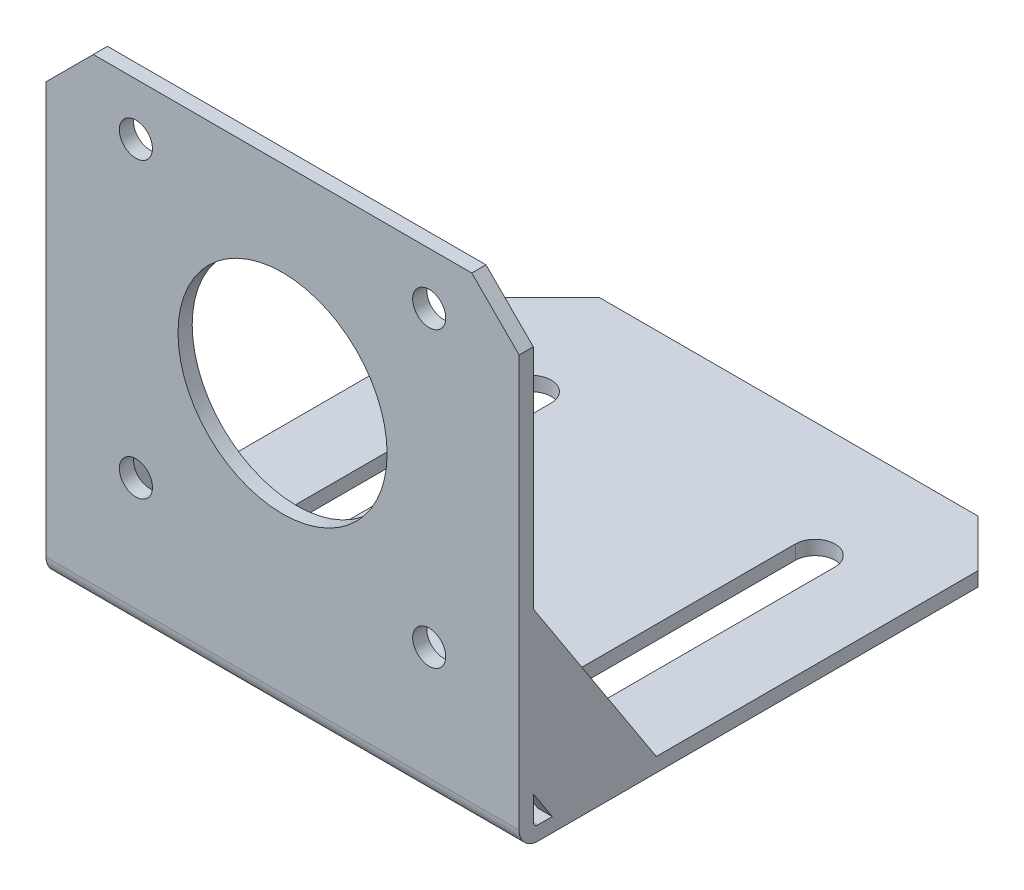
ISO-10303-21;
HEADER;
FILE_DESCRIPTION(('STEP AP214'),'2;1');
FILE_NAME('part.step','',(''),(''),'','','');
FILE_SCHEMA(('AUTOMOTIVE_DESIGN { 1 0 10303 214 1 1 1 1 }'));
ENDSEC;
DATA;
#1=APPLICATION_CONTEXT('core data for automotive mechanical design processes');
#2=APPLICATION_PROTOCOL_DEFINITION('international standard','automotive_design',2000,#1);
#3=PRODUCT_CONTEXT('',#1,'mechanical');
#4=PRODUCT('Part','Part','',(#3));
#5=PRODUCT_RELATED_PRODUCT_CATEGORY('part','',(#4));
#6=PRODUCT_DEFINITION_FORMATION('','',#4);
#7=PRODUCT_DEFINITION_CONTEXT('part definition',#1,'design');
#8=PRODUCT_DEFINITION('design','',#6,#7);
#9=PRODUCT_DEFINITION_SHAPE('','',#8);
#10=(LENGTH_UNIT() NAMED_UNIT(*) SI_UNIT(.MILLI.,.METRE.));
#11=(NAMED_UNIT(*) PLANE_ANGLE_UNIT() SI_UNIT($,.RADIAN.));
#12=(NAMED_UNIT(*) SI_UNIT($,.STERADIAN.) SOLID_ANGLE_UNIT());
#13=UNCERTAINTY_MEASURE_WITH_UNIT(LENGTH_MEASURE(1.E-05),#10,'distance_accuracy_value','');
#14=(GEOMETRIC_REPRESENTATION_CONTEXT(3) GLOBAL_UNCERTAINTY_ASSIGNED_CONTEXT((#13)) GLOBAL_UNIT_ASSIGNED_CONTEXT((#10,
#11,#12)) REPRESENTATION_CONTEXT('',''));
#15=CARTESIAN_POINT('',(0.,0.,0.));
#16=DIRECTION('',(0.,0.,1.));
#17=DIRECTION('',(1.,0.,0.));
#18=AXIS2_PLACEMENT_3D('',#15,#16,#17);
#19=CARTESIAN_POINT('',(50.,1.5,-2.00000000000001));
#20=DIRECTION('',(0.,1.,0.));
#21=DIRECTION('',(0.,0.,1.));
#22=AXIS2_PLACEMENT_3D('',#19,#20,#21);
#23=PLANE('',#22);
#24=CARTESIAN_POINT('',(40.,1.5,-13.7066664875901));
#25=DIRECTION('',(0.,1.,0.));
#26=DIRECTION('',(0.,0.,-1.));
#27=AXIS2_PLACEMENT_3D('',#24,#25,#26);
#28=CIRCLE('',#27,2.1);
#29=CARTESIAN_POINT('',(37.9,1.5,-13.7066664875901));
#30=VERTEX_POINT('',#29);
#31=CARTESIAN_POINT('',(42.1,1.5,-13.7066664875901));
#32=VERTEX_POINT('',#31);
#33=EDGE_CURVE('E229',#30,#32,#28,.T.);
#34=ORIENTED_EDGE('',*,*,#33,.F.);
#35=DIRECTION('',(0.,0.,1.));
#36=VECTOR('',#35,1.);
#37=CARTESIAN_POINT('',(37.9,1.5,-13.7066664875901));
#38=LINE('',#37,#36);
#39=CARTESIAN_POINT('',(37.9,1.5,-41.2933335124099));
#40=VERTEX_POINT('',#39);
#41=EDGE_CURVE('E247',#40,#30,#38,.T.);
#42=ORIENTED_EDGE('',*,*,#41,.F.);
#43=CARTESIAN_POINT('',(40.,1.5,-41.2933335124099));
#44=DIRECTION('',(0.,1.,0.));
#45=DIRECTION('',(0.,0.,-1.));
#46=AXIS2_PLACEMENT_3D('',#43,#44,#45);
#47=CIRCLE('',#46,2.09999999999998);
#48=CARTESIAN_POINT('',(42.1,1.5,-41.2933335124099));
#49=VERTEX_POINT('',#48);
#50=EDGE_CURVE('E250',#49,#40,#47,.T.);
#51=ORIENTED_EDGE('',*,*,#50,.F.);
#52=DIRECTION('',(0.,0.,-1.));
#53=VECTOR('',#52,1.);
#54=CARTESIAN_POINT('',(42.1,1.5,-13.7066664875901));
#55=LINE('',#54,#53);
#56=EDGE_CURVE('E256',#32,#49,#55,.T.);
#57=ORIENTED_EDGE('',*,*,#56,.F.);
#58=EDGE_LOOP('',(#34,#42,#51,#57));
#59=FACE_BOUND('',#58,.T.);
#60=CARTESIAN_POINT('',(10.,1.5,-13.7066664875901));
#61=DIRECTION('',(0.,1.,0.));
#62=DIRECTION('',(0.,0.,1.));
#63=AXIS2_PLACEMENT_3D('',#60,#61,#62);
#64=CIRCLE('',#63,2.10000000000001);
#65=CARTESIAN_POINT('',(7.9,1.5,-13.7066664875901));
#66=VERTEX_POINT('',#65);
#67=CARTESIAN_POINT('',(12.1,1.5,-13.7066664875901));
#68=VERTEX_POINT('',#67);
#69=EDGE_CURVE('E262',#66,#68,#64,.T.);
#70=ORIENTED_EDGE('',*,*,#69,.F.);
#71=DIRECTION('',(0.,0.,1.));
#72=VECTOR('',#71,1.);
#73=CARTESIAN_POINT('',(7.9,1.5,-13.7066664875901));
#74=LINE('',#73,#72);
#75=CARTESIAN_POINT('',(7.90000000000001,1.5,-41.2933335124099));
#76=VERTEX_POINT('',#75);
#77=EDGE_CURVE('E270',#76,#66,#74,.T.);
#78=ORIENTED_EDGE('',*,*,#77,.F.);
#79=CARTESIAN_POINT('',(10.,1.5,-41.2933335124099));
#80=DIRECTION('',(0.,1.,0.));
#81=DIRECTION('',(0.,0.,1.));
#82=AXIS2_PLACEMENT_3D('',#79,#80,#81);
#83=CIRCLE('',#82,2.09999999999999);
#84=CARTESIAN_POINT('',(12.1,1.5,-41.2933335124099));
#85=VERTEX_POINT('',#84);
#86=EDGE_CURVE('E284',#85,#76,#83,.T.);
#87=ORIENTED_EDGE('',*,*,#86,.F.);
#88=DIRECTION('',(0.,0.,-1.));
#89=VECTOR('',#88,1.);
#90=CARTESIAN_POINT('',(12.1,1.5,-13.7066664875901));
#91=LINE('',#90,#89);
#92=EDGE_CURVE('E281',#68,#85,#91,.T.);
#93=ORIENTED_EDGE('',*,*,#92,.F.);
#94=EDGE_LOOP('',(#70,#78,#87,#93));
#95=FACE_BOUND('',#94,.T.);
#96=DIRECTION('',(-1.,0.,0.));
#97=VECTOR('',#96,1.);
#98=CARTESIAN_POINT('',(50.,1.5,-53.5));
#99=LINE('',#98,#97);
#100=CARTESIAN_POINT('',(45.,1.5,-53.5));
#101=VERTEX_POINT('',#100);
#102=CARTESIAN_POINT('',(5.00000000000003,1.5,-53.5));
#103=VERTEX_POINT('',#102);
#104=EDGE_CURVE('E430',#101,#103,#99,.T.);
#105=ORIENTED_EDGE('',*,*,#104,.T.);
#106=DIRECTION('',(-0.707106781186549,0.,0.707106781186547));
#107=VECTOR('',#106,1.);
#108=CARTESIAN_POINT('',(1.75000000000008,1.5,-50.2500000000001));
#109=LINE('',#108,#107);
#110=CARTESIAN_POINT('',(0.,1.5,-48.5));
#111=VERTEX_POINT('',#110);
#112=EDGE_CURVE('E11',#103,#111,#109,.T.);
#113=ORIENTED_EDGE('',*,*,#112,.T.);
#114=DIRECTION('',(0.,0.,-1.));
#115=VECTOR('',#114,1.);
#116=CARTESIAN_POINT('',(0.,1.5,-2.00000000000001));
#117=LINE('',#116,#115);
#118=CARTESIAN_POINT('',(0.,1.5,-14.5));
#119=VERTEX_POINT('',#118);
#120=EDGE_CURVE('E401',#119,#111,#117,.T.);
#121=ORIENTED_EDGE('',*,*,#120,.F.);
#122=DIRECTION('',(-1.,0.,0.));
#123=VECTOR('',#122,1.);
#124=CARTESIAN_POINT('',(1.5,1.5,-14.5));
#125=LINE('',#124,#123);
#126=CARTESIAN_POINT('',(1.5,1.5,-14.5));
#127=VERTEX_POINT('',#126);
#128=EDGE_CURVE('E318',#127,#119,#125,.T.);
#129=ORIENTED_EDGE('',*,*,#128,.F.);
#130=DIRECTION('',(0.,0.,-1.));
#131=VECTOR('',#130,1.);
#132=CARTESIAN_POINT('',(1.5,1.5,-3.5));
#133=LINE('',#132,#131);
#134=CARTESIAN_POINT('',(1.5,1.5,-3.5));
#135=VERTEX_POINT('',#134);
#136=EDGE_CURVE('E304',#135,#127,#133,.T.);
#137=ORIENTED_EDGE('',*,*,#136,.F.);
#138=DIRECTION('',(-1.,0.,0.));
#139=VECTOR('',#138,1.);
#140=CARTESIAN_POINT('',(1.5,1.5,-3.5));
#141=LINE('',#140,#139);
#142=CARTESIAN_POINT('',(0.,1.5,-3.5));
#143=VERTEX_POINT('',#142);
#144=EDGE_CURVE('E315',#135,#143,#141,.T.);
#145=ORIENTED_EDGE('',*,*,#144,.T.);
#146=CARTESIAN_POINT('',(0.,1.5,-2.00000000000001));
#147=VERTEX_POINT('',#146);
#148=EDGE_CURVE('E402',#147,#143,#117,.T.);
#149=ORIENTED_EDGE('',*,*,#148,.F.);
#150=DIRECTION('',(-1.,0.,0.));
#151=VECTOR('',#150,1.);
#152=CARTESIAN_POINT('',(50.,1.5,-2.00000000000001));
#153=LINE('',#152,#151);
#154=CARTESIAN_POINT('',(50.,1.5,-2.00000000000001));
#155=VERTEX_POINT('',#154);
#156=EDGE_CURVE('E428',#155,#147,#153,.T.);
#157=ORIENTED_EDGE('',*,*,#156,.F.);
#158=DIRECTION('',(0.,0.,-1.));
#159=VECTOR('',#158,1.);
#160=CARTESIAN_POINT('',(50.,1.5,-2.00000000000001));
#161=LINE('',#160,#159);
#162=CARTESIAN_POINT('',(50.,1.5,-3.5));
#163=VERTEX_POINT('',#162);
#164=EDGE_CURVE('E386',#155,#163,#161,.T.);
#165=ORIENTED_EDGE('',*,*,#164,.T.);
#166=DIRECTION('',(1.,0.,0.));
#167=VECTOR('',#166,1.);
#168=CARTESIAN_POINT('',(48.5,1.5,-3.5));
#169=LINE('',#168,#167);
#170=CARTESIAN_POINT('',(48.5,1.5,-3.5));
#171=VERTEX_POINT('',#170);
#172=EDGE_CURVE('E346',#171,#163,#169,.T.);
#173=ORIENTED_EDGE('',*,*,#172,.F.);
#174=DIRECTION('',(0.,0.,-1.));
#175=VECTOR('',#174,1.);
#176=CARTESIAN_POINT('',(48.5,1.5,-3.5));
#177=LINE('',#176,#175);
#178=CARTESIAN_POINT('',(48.5,1.5,-14.5));
#179=VERTEX_POINT('',#178);
#180=EDGE_CURVE('E329',#171,#179,#177,.T.);
#181=ORIENTED_EDGE('',*,*,#180,.T.);
#182=DIRECTION('',(1.,0.,0.));
#183=VECTOR('',#182,1.);
#184=CARTESIAN_POINT('',(48.5,1.5,-14.5));
#185=LINE('',#184,#183);
#186=CARTESIAN_POINT('',(50.,1.5,-14.5));
#187=VERTEX_POINT('',#186);
#188=EDGE_CURVE('E343',#179,#187,#185,.T.);
#189=ORIENTED_EDGE('',*,*,#188,.T.);
#190=CARTESIAN_POINT('',(50.,1.5,-48.5));
#191=VERTEX_POINT('',#190);
#192=EDGE_CURVE('E384',#187,#191,#161,.T.);
#193=ORIENTED_EDGE('',*,*,#192,.T.);
#194=DIRECTION('',(0.707106781186547,0.,0.707106781186549));
#195=VECTOR('',#194,1.);
#196=CARTESIAN_POINT('',(73.25,1.5,-25.2499999999999));
#197=LINE('',#196,#195);
#198=EDGE_CURVE('E45',#191,#101,#197,.F.);
#199=ORIENTED_EDGE('',*,*,#198,.T.);
#200=EDGE_LOOP('',(#105,#113,#121,#129,#137,#145,#149,#157,#165,#173,#181,#189,#193,#199));
#201=FACE_BOUND('',#200,.T.);
#202=ADVANCED_FACE('F37',(#59,#95,#201),#23,.T.);
#203=CARTESIAN_POINT('',(50.,2.00000000000001,-1.5));
#204=DIRECTION('',(0.,0.,-1.));
#205=DIRECTION('',(-1.,0.,0.));
#206=AXIS2_PLACEMENT_3D('',#203,#204,#205);
#207=PLANE('',#206);
#208=CARTESIAN_POINT('',(25.,29.5,-1.5));
#209=DIRECTION('',(0.,0.,-1.));
#210=DIRECTION('',(-1.,0.,0.));
#211=AXIS2_PLACEMENT_3D('',#208,#209,#210);
#212=CIRCLE('',#211,11.05);
#213=CARTESIAN_POINT('',(13.95,29.5,-1.5));
#214=VERTEX_POINT('',#213);
#215=EDGE_CURVE('E372',#214,#214,#212,.T.);
#216=ORIENTED_EDGE('',*,*,#215,.F.);
#217=EDGE_LOOP('',(#216));
#218=FACE_BOUND('',#217,.T.);
#219=CARTESIAN_POINT('',(40.5,45.,-1.5));
#220=DIRECTION('',(0.,0.,-1.));
#221=DIRECTION('',(-1.,0.,0.));
#222=AXIS2_PLACEMENT_3D('',#219,#220,#221);
#223=CIRCLE('',#222,1.75);
#224=CARTESIAN_POINT('',(38.75,45.,-1.5));
#225=VERTEX_POINT('',#224);
#226=EDGE_CURVE('E366',#225,#225,#223,.T.);
#227=ORIENTED_EDGE('',*,*,#226,.F.);
#228=EDGE_LOOP('',(#227));
#229=FACE_BOUND('',#228,.T.);
#230=CARTESIAN_POINT('',(9.49999999999999,45.,-1.5));
#231=DIRECTION('',(0.,0.,-1.));
#232=DIRECTION('',(-1.,0.,0.));
#233=AXIS2_PLACEMENT_3D('',#230,#231,#232);
#234=CIRCLE('',#233,1.75);
#235=CARTESIAN_POINT('',(7.74999999999999,45.,-1.5));
#236=VERTEX_POINT('',#235);
#237=EDGE_CURVE('E360',#236,#236,#234,.T.);
#238=ORIENTED_EDGE('',*,*,#237,.F.);
#239=EDGE_LOOP('',(#238));
#240=FACE_BOUND('',#239,.T.);
#241=CARTESIAN_POINT('',(9.5,14.,-1.5));
#242=DIRECTION('',(0.,0.,-1.));
#243=DIRECTION('',(-1.,0.,0.));
#244=AXIS2_PLACEMENT_3D('',#241,#242,#243);
#245=CIRCLE('',#244,1.75000000000001);
#246=CARTESIAN_POINT('',(7.74999999999999,14.,-1.5));
#247=VERTEX_POINT('',#246);
#248=EDGE_CURVE('E354',#247,#247,#245,.T.);
#249=ORIENTED_EDGE('',*,*,#248,.F.);
#250=EDGE_LOOP('',(#249));
#251=FACE_BOUND('',#250,.T.);
#252=CARTESIAN_POINT('',(40.5,14.,-1.5));
#253=DIRECTION('',(0.,0.,-1.));
#254=DIRECTION('',(-1.,0.,0.));
#255=AXIS2_PLACEMENT_3D('',#252,#253,#254);
#256=CIRCLE('',#255,1.75000000000001);
#257=CARTESIAN_POINT('',(38.75,14.,-1.5));
#258=VERTEX_POINT('',#257);
#259=EDGE_CURVE('E342',#258,#258,#256,.T.);
#260=ORIENTED_EDGE('',*,*,#259,.F.);
#261=EDGE_LOOP('',(#260));
#262=FACE_BOUND('',#261,.T.);
#263=DIRECTION('',(-1.,0.,0.));
#264=VECTOR('',#263,1.);
#265=CARTESIAN_POINT('',(50.,50.5,-1.5));
#266=LINE('',#265,#264);
#267=CARTESIAN_POINT('',(45.,50.5,-1.5));
#268=VERTEX_POINT('',#267);
#269=CARTESIAN_POINT('',(5.00000000000003,50.5,-1.5));
#270=VERTEX_POINT('',#269);
#271=EDGE_CURVE('E422',#268,#270,#266,.T.);
#272=ORIENTED_EDGE('',*,*,#271,.F.);
#273=DIRECTION('',(-0.707106781186547,0.707106781186549,0.));
#274=VECTOR('',#273,1.);
#275=CARTESIAN_POINT('',(71.75,23.7499999999999,-1.5));
#276=LINE('',#275,#274);
#277=CARTESIAN_POINT('',(50.,45.5,-1.5));
#278=VERTEX_POINT('',#277);
#279=EDGE_CURVE('E441',#268,#278,#276,.F.);
#280=ORIENTED_EDGE('',*,*,#279,.T.);
#281=DIRECTION('',(0.,1.,0.));
#282=VECTOR('',#281,1.);
#283=CARTESIAN_POINT('',(50.,2.00000000000001,-1.5));
#284=LINE('',#283,#282);
#285=CARTESIAN_POINT('',(50.,21.5,-1.5));
#286=VERTEX_POINT('',#285);
#287=EDGE_CURVE('E392',#278,#286,#284,.F.);
#288=ORIENTED_EDGE('',*,*,#287,.T.);
#289=DIRECTION('',(1.,0.,0.));
#290=VECTOR('',#289,1.);
#291=CARTESIAN_POINT('',(48.5,21.5,-1.5));
#292=LINE('',#291,#290);
#293=CARTESIAN_POINT('',(48.5,21.5,-1.5));
#294=VERTEX_POINT('',#293);
#295=EDGE_CURVE('E339',#294,#286,#292,.T.);
#296=ORIENTED_EDGE('',*,*,#295,.F.);
#297=DIRECTION('',(0.,-1.,0.));
#298=VECTOR('',#297,1.);
#299=CARTESIAN_POINT('',(48.5,21.5,-1.5));
#300=LINE('',#299,#298);
#301=CARTESIAN_POINT('',(48.5,4.57692307692308,-1.5));
#302=VERTEX_POINT('',#301);
#303=EDGE_CURVE('E323',#294,#302,#300,.T.);
#304=ORIENTED_EDGE('',*,*,#303,.T.);
#305=DIRECTION('',(1.,0.,0.));
#306=VECTOR('',#305,1.);
#307=CARTESIAN_POINT('',(48.5,4.57692307692308,-1.5));
#308=LINE('',#307,#306);
#309=CARTESIAN_POINT('',(50.,4.57692307692308,-1.5));
#310=VERTEX_POINT('',#309);
#311=EDGE_CURVE('E334',#302,#310,#308,.T.);
#312=ORIENTED_EDGE('',*,*,#311,.T.);
#313=CARTESIAN_POINT('',(50.,2.,-1.5));
#314=VERTEX_POINT('',#313);
#315=EDGE_CURVE('E391',#310,#314,#284,.F.);
#316=ORIENTED_EDGE('',*,*,#315,.T.);
#317=DIRECTION('',(-1.,0.,0.));
#318=VECTOR('',#317,1.);
#319=CARTESIAN_POINT('',(50.,2.,-1.5));
#320=LINE('',#319,#318);
#321=CARTESIAN_POINT('',(0.,2.,-1.5));
#322=VERTEX_POINT('',#321);
#323=EDGE_CURVE('E425',#314,#322,#320,.T.);
#324=ORIENTED_EDGE('',*,*,#323,.T.);
#325=DIRECTION('',(0.,1.,0.));
#326=VECTOR('',#325,1.);
#327=CARTESIAN_POINT('',(0.,2.00000000000001,-1.5));
#328=LINE('',#327,#326);
#329=CARTESIAN_POINT('',(0.,4.57692307692308,-1.5));
#330=VERTEX_POINT('',#329);
#331=EDGE_CURVE('E408',#330,#322,#328,.F.);
#332=ORIENTED_EDGE('',*,*,#331,.F.);
#333=DIRECTION('',(-1.,0.,0.));
#334=VECTOR('',#333,1.);
#335=CARTESIAN_POINT('',(1.5,4.57692307692308,-1.5));
#336=LINE('',#335,#334);
#337=CARTESIAN_POINT('',(1.5,4.57692307692308,-1.5));
#338=VERTEX_POINT('',#337);
#339=EDGE_CURVE('E312',#338,#330,#336,.T.);
#340=ORIENTED_EDGE('',*,*,#339,.F.);
#341=DIRECTION('',(0.,-1.,0.));
#342=VECTOR('',#341,1.);
#343=CARTESIAN_POINT('',(1.5,21.5,-1.5));
#344=LINE('',#343,#342);
#345=CARTESIAN_POINT('',(1.5,21.5,-1.5));
#346=VERTEX_POINT('',#345);
#347=EDGE_CURVE('E298',#346,#338,#344,.T.);
#348=ORIENTED_EDGE('',*,*,#347,.F.);
#349=DIRECTION('',(-1.,0.,0.));
#350=VECTOR('',#349,1.);
#351=CARTESIAN_POINT('',(1.5,21.5,-1.5));
#352=LINE('',#351,#350);
#353=CARTESIAN_POINT('',(0.,21.5,-1.5));
#354=VERTEX_POINT('',#353);
#355=EDGE_CURVE('E308',#346,#354,#352,.T.);
#356=ORIENTED_EDGE('',*,*,#355,.T.);
#357=CARTESIAN_POINT('',(0.,45.5,-1.5));
#358=VERTEX_POINT('',#357);
#359=EDGE_CURVE('E409',#358,#354,#328,.F.);
#360=ORIENTED_EDGE('',*,*,#359,.F.);
#361=DIRECTION('',(0.707106781186549,0.707106781186547,0.));
#362=VECTOR('',#361,1.);
#363=CARTESIAN_POINT('',(3.25000000000009,48.7500000000001,-1.5));
#364=LINE('',#363,#362);
#365=EDGE_CURVE('E439',#358,#270,#364,.T.);
#366=ORIENTED_EDGE('',*,*,#365,.T.);
#367=EDGE_LOOP('',(#272,#280,#288,#296,#304,#312,#316,#324,#332,#340,#348,#356,#360,#366));
#368=FACE_BOUND('',#367,.T.);
#369=ADVANCED_FACE('F537',(#218,#229,#240,#251,#262,#368),#207,.T.);
#370=CARTESIAN_POINT('',(50.,0.,-2.00000000000001));
#371=DIRECTION('',(0.,1.,0.));
#372=DIRECTION('',(0.,0.,1.));
#373=AXIS2_PLACEMENT_3D('',#370,#371,#372);
#374=PLANE('',#373);
#375=DIRECTION('',(0.,0.,1.));
#376=VECTOR('',#375,1.);
#377=CARTESIAN_POINT('',(37.9,0.,-13.7066664875901));
#378=LINE('',#377,#376);
#379=CARTESIAN_POINT('',(37.9,0.,-41.2933335124099));
#380=VERTEX_POINT('',#379);
#381=CARTESIAN_POINT('',(37.9,0.,-13.7066664875901));
#382=VERTEX_POINT('',#381);
#383=EDGE_CURVE('E234',#380,#382,#378,.T.);
#384=ORIENTED_EDGE('',*,*,#383,.T.);
#385=CARTESIAN_POINT('',(40.,0.,-13.7066664875901));
#386=DIRECTION('',(0.,1.,0.));
#387=DIRECTION('',(0.,0.,-1.));
#388=AXIS2_PLACEMENT_3D('',#385,#386,#387);
#389=CIRCLE('',#388,2.1);
#390=CARTESIAN_POINT('',(42.1,0.,-13.7066664875901));
#391=VERTEX_POINT('',#390);
#392=EDGE_CURVE('E226',#382,#391,#389,.T.);
#393=ORIENTED_EDGE('',*,*,#392,.T.);
#394=DIRECTION('',(0.,0.,-1.));
#395=VECTOR('',#394,1.);
#396=CARTESIAN_POINT('',(42.1,0.,-13.7066664875901));
#397=LINE('',#396,#395);
#398=CARTESIAN_POINT('',(42.1,0.,-41.2933335124099));
#399=VERTEX_POINT('',#398);
#400=EDGE_CURVE('E238',#391,#399,#397,.T.);
#401=ORIENTED_EDGE('',*,*,#400,.T.);
#402=CARTESIAN_POINT('',(40.,0.,-41.2933335124099));
#403=DIRECTION('',(0.,1.,0.));
#404=DIRECTION('',(0.,0.,-1.));
#405=AXIS2_PLACEMENT_3D('',#402,#403,#404);
#406=CIRCLE('',#405,2.09999999999998);
#407=EDGE_CURVE('E242',#399,#380,#406,.T.);
#408=ORIENTED_EDGE('',*,*,#407,.T.);
#409=EDGE_LOOP('',(#384,#393,#401,#408));
#410=FACE_BOUND('',#409,.T.);
#411=DIRECTION('',(0.,0.,1.));
#412=VECTOR('',#411,1.);
#413=CARTESIAN_POINT('',(7.9,0.,-13.7066664875901));
#414=LINE('',#413,#412);
#415=CARTESIAN_POINT('',(7.90000000000001,0.,-41.2933335124099));
#416=VERTEX_POINT('',#415);
#417=CARTESIAN_POINT('',(7.9,0.,-13.7066664875901));
#418=VERTEX_POINT('',#417);
#419=EDGE_CURVE('E276',#416,#418,#414,.T.);
#420=ORIENTED_EDGE('',*,*,#419,.T.);
#421=CARTESIAN_POINT('',(10.,0.,-13.7066664875901));
#422=DIRECTION('',(0.,1.,0.));
#423=DIRECTION('',(0.,0.,1.));
#424=AXIS2_PLACEMENT_3D('',#421,#422,#423);
#425=CIRCLE('',#424,2.10000000000001);
#426=CARTESIAN_POINT('',(12.1,0.,-13.7066664875901));
#427=VERTEX_POINT('',#426);
#428=EDGE_CURVE('E266',#418,#427,#425,.T.);
#429=ORIENTED_EDGE('',*,*,#428,.T.);
#430=DIRECTION('',(0.,0.,-1.));
#431=VECTOR('',#430,1.);
#432=CARTESIAN_POINT('',(12.1,0.,-13.7066664875901));
#433=LINE('',#432,#431);
#434=CARTESIAN_POINT('',(12.1,0.,-41.2933335124099));
#435=VERTEX_POINT('',#434);
#436=EDGE_CURVE('E269',#427,#435,#433,.T.);
#437=ORIENTED_EDGE('',*,*,#436,.T.);
#438=CARTESIAN_POINT('',(10.,0.,-41.2933335124099));
#439=DIRECTION('',(0.,1.,0.));
#440=DIRECTION('',(0.,0.,1.));
#441=AXIS2_PLACEMENT_3D('',#438,#439,#440);
#442=CIRCLE('',#441,2.09999999999999);
#443=EDGE_CURVE('E273',#435,#416,#442,.T.);
#444=ORIENTED_EDGE('',*,*,#443,.T.);
#445=EDGE_LOOP('',(#420,#429,#437,#444));
#446=FACE_BOUND('',#445,.T.);
#447=DIRECTION('',(0.,0.,-1.));
#448=VECTOR('',#447,1.);
#449=CARTESIAN_POINT('',(0.,0.,-2.00000000000001));
#450=LINE('',#449,#448);
#451=CARTESIAN_POINT('',(0.,0.,-2.00000000000001));
#452=VERTEX_POINT('',#451);
#453=CARTESIAN_POINT('',(0.,0.,-48.5));
#454=VERTEX_POINT('',#453);
#455=EDGE_CURVE('E378',#452,#454,#450,.T.);
#456=ORIENTED_EDGE('',*,*,#455,.T.);
#457=DIRECTION('',(0.707106781186549,0.,-0.707106781186547));
#458=VECTOR('',#457,1.);
#459=CARTESIAN_POINT('',(0.,0.,-48.5));
#460=LINE('',#459,#458);
#461=CARTESIAN_POINT('',(5.00000000000002,0.,-53.5));
#462=VERTEX_POINT('',#461);
#463=EDGE_CURVE('E459',#454,#462,#460,.T.);
#464=ORIENTED_EDGE('',*,*,#463,.T.);
#465=DIRECTION('',(-1.,0.,0.));
#466=VECTOR('',#465,1.);
#467=CARTESIAN_POINT('',(50.,0.,-53.5));
#468=LINE('',#467,#466);
#469=CARTESIAN_POINT('',(45.,0.,-53.5));
#470=VERTEX_POINT('',#469);
#471=EDGE_CURVE('E432',#470,#462,#468,.T.);
#472=ORIENTED_EDGE('',*,*,#471,.F.);
#473=DIRECTION('',(-0.707106781186547,0.,-0.707106781186549));
#474=VECTOR('',#473,1.);
#475=CARTESIAN_POINT('',(45.,0.,-53.5));
#476=LINE('',#475,#474);
#477=CARTESIAN_POINT('',(50.,0.,-48.5));
#478=VERTEX_POINT('',#477);
#479=EDGE_CURVE('E457',#470,#478,#476,.F.);
#480=ORIENTED_EDGE('',*,*,#479,.T.);
#481=DIRECTION('',(0.,0.,-1.));
#482=VECTOR('',#481,1.);
#483=CARTESIAN_POINT('',(50.,0.,-2.00000000000001));
#484=LINE('',#483,#482);
#485=CARTESIAN_POINT('',(50.,0.,-2.00000000000001));
#486=VERTEX_POINT('',#485);
#487=EDGE_CURVE('E381',#486,#478,#484,.T.);
#488=ORIENTED_EDGE('',*,*,#487,.F.);
#489=DIRECTION('',(-1.,0.,0.));
#490=VECTOR('',#489,1.);
#491=CARTESIAN_POINT('',(50.,0.,-2.00000000000001));
#492=LINE('',#491,#490);
#493=EDGE_CURVE('E398',#486,#452,#492,.T.);
#494=ORIENTED_EDGE('',*,*,#493,.T.);
#495=EDGE_LOOP('',(#456,#464,#472,#480,#488,#494));
#496=FACE_BOUND('',#495,.T.);
#497=ADVANCED_FACE('F244',(#410,#446,#496),#374,.F.);
#498=CARTESIAN_POINT('',(50.,1.5,-53.5));
#499=DIRECTION('',(0.,0.,-1.));
#500=DIRECTION('',(-1.,0.,0.));
#501=AXIS2_PLACEMENT_3D('',#498,#499,#500);
#502=PLANE('',#501);
#503=ORIENTED_EDGE('',*,*,#471,.T.);
#504=DIRECTION('',(0.,1.,0.));
#505=VECTOR('',#504,1.);
#506=CARTESIAN_POINT('',(5.00000000000002,1.5,-53.5));
#507=LINE('',#506,#505);
#508=EDGE_CURVE('E52',#462,#103,#507,.T.);
#509=ORIENTED_EDGE('',*,*,#508,.T.);
#510=ORIENTED_EDGE('',*,*,#104,.F.);
#511=DIRECTION('',(0.,-1.,0.));
#512=VECTOR('',#511,1.);
#513=CARTESIAN_POINT('',(45.,1.5,-53.5));
#514=LINE('',#513,#512);
#515=EDGE_CURVE('E461',#101,#470,#514,.T.);
#516=ORIENTED_EDGE('',*,*,#515,.T.);
#517=EDGE_LOOP('',(#503,#509,#510,#516));
#518=FACE_BOUND('',#517,.T.);
#519=ADVANCED_FACE('F466',(#518),#502,.T.);
#520=CARTESIAN_POINT('',(50.,2.,-2.));
#521=DIRECTION('',(-1.,0.,0.));
#522=DIRECTION('',(0.,0.,1.));
#523=AXIS2_PLACEMENT_3D('',#520,#521,#522);
#524=CYLINDRICAL_SURFACE('',#523,0.5);
#525=CARTESIAN_POINT('',(0.,2.,-2.));
#526=DIRECTION('',(1.,0.,0.));
#527=DIRECTION('',(0.,0.,-1.));
#528=AXIS2_PLACEMENT_3D('',#525,#526,#527);
#529=CIRCLE('',#528,0.5);
#530=EDGE_CURVE('E405',#322,#147,#529,.T.);
#531=ORIENTED_EDGE('',*,*,#530,.F.);
#532=ORIENTED_EDGE('',*,*,#323,.F.);
#533=CARTESIAN_POINT('',(50.,2.,-2.));
#534=DIRECTION('',(1.,0.,0.));
#535=DIRECTION('',(0.,0.,-1.));
#536=AXIS2_PLACEMENT_3D('',#533,#534,#535);
#537=CIRCLE('',#536,0.5);
#538=EDGE_CURVE('E388',#314,#155,#537,.T.);
#539=ORIENTED_EDGE('',*,*,#538,.T.);
#540=ORIENTED_EDGE('',*,*,#156,.T.);
#541=EDGE_LOOP('',(#531,#532,#539,#540));
#542=FACE_BOUND('',#541,.T.);
#543=ADVANCED_FACE('F501',(#542),#524,.F.);
#544=CARTESIAN_POINT('',(50.,50.5,0.));
#545=DIRECTION('',(0.,1.,0.));
#546=DIRECTION('',(0.,0.,1.));
#547=AXIS2_PLACEMENT_3D('',#544,#545,#546);
#548=PLANE('',#547);
#549=DIRECTION('',(-1.,0.,0.));
#550=VECTOR('',#549,1.);
#551=CARTESIAN_POINT('',(50.,50.5,0.));
#552=LINE('',#551,#550);
#553=CARTESIAN_POINT('',(45.,50.5,0.));
#554=VERTEX_POINT('',#553);
#555=CARTESIAN_POINT('',(5.00000000000005,50.5,0.));
#556=VERTEX_POINT('',#555);
#557=EDGE_CURVE('E419',#554,#556,#552,.T.);
#558=ORIENTED_EDGE('',*,*,#557,.F.);
#559=DIRECTION('',(0.,0.,-1.));
#560=VECTOR('',#559,1.);
#561=CARTESIAN_POINT('',(45.,50.5,0.));
#562=LINE('',#561,#560);
#563=EDGE_CURVE('E436',#554,#268,#562,.T.);
#564=ORIENTED_EDGE('',*,*,#563,.T.);
#565=ORIENTED_EDGE('',*,*,#271,.T.);
#566=DIRECTION('',(0.,0.,1.));
#567=VECTOR('',#566,1.);
#568=CARTESIAN_POINT('',(5.00000000000003,50.5,0.));
#569=LINE('',#568,#567);
#570=EDGE_CURVE('E434',#270,#556,#569,.T.);
#571=ORIENTED_EDGE('',*,*,#570,.T.);
#572=EDGE_LOOP('',(#558,#564,#565,#571));
#573=FACE_BOUND('',#572,.T.);
#574=ADVANCED_FACE('F540',(#573),#548,.T.);
#575=CARTESIAN_POINT('',(50.,2.00000000000001,0.));
#576=DIRECTION('',(0.,0.,-1.));
#577=DIRECTION('',(-1.,0.,0.));
#578=AXIS2_PLACEMENT_3D('',#575,#576,#577);
#579=PLANE('',#578);
#580=CARTESIAN_POINT('',(40.5,14.,0.));
#581=DIRECTION('',(0.,0.,-1.));
#582=DIRECTION('',(-1.,0.,0.));
#583=AXIS2_PLACEMENT_3D('',#580,#581,#582);
#584=CIRCLE('',#583,1.75000000000001);
#585=CARTESIAN_POINT('',(38.75,14.,0.));
#586=VERTEX_POINT('',#585);
#587=EDGE_CURVE('E351',#586,#586,#584,.T.);
#588=ORIENTED_EDGE('',*,*,#587,.T.);
#589=EDGE_LOOP('',(#588));
#590=FACE_BOUND('',#589,.T.);
#591=CARTESIAN_POINT('',(9.5,14.,0.));
#592=DIRECTION('',(0.,0.,-1.));
#593=DIRECTION('',(-1.,0.,0.));
#594=AXIS2_PLACEMENT_3D('',#591,#592,#593);
#595=CIRCLE('',#594,1.75000000000001);
#596=CARTESIAN_POINT('',(7.74999999999999,14.,0.));
#597=VERTEX_POINT('',#596);
#598=EDGE_CURVE('E357',#597,#597,#595,.T.);
#599=ORIENTED_EDGE('',*,*,#598,.T.);
#600=EDGE_LOOP('',(#599));
#601=FACE_BOUND('',#600,.T.);
#602=CARTESIAN_POINT('',(9.49999999999999,45.,0.));
#603=DIRECTION('',(0.,0.,-1.));
#604=DIRECTION('',(-1.,0.,0.));
#605=AXIS2_PLACEMENT_3D('',#602,#603,#604);
#606=CIRCLE('',#605,1.75);
#607=CARTESIAN_POINT('',(7.74999999999999,45.,0.));
#608=VERTEX_POINT('',#607);
#609=EDGE_CURVE('E363',#608,#608,#606,.T.);
#610=ORIENTED_EDGE('',*,*,#609,.T.);
#611=EDGE_LOOP('',(#610));
#612=FACE_BOUND('',#611,.T.);
#613=CARTESIAN_POINT('',(40.5,45.,0.));
#614=DIRECTION('',(0.,0.,-1.));
#615=DIRECTION('',(-1.,0.,0.));
#616=AXIS2_PLACEMENT_3D('',#613,#614,#615);
#617=CIRCLE('',#616,1.75);
#618=CARTESIAN_POINT('',(38.75,45.,0.));
#619=VERTEX_POINT('',#618);
#620=EDGE_CURVE('E369',#619,#619,#617,.T.);
#621=ORIENTED_EDGE('',*,*,#620,.T.);
#622=EDGE_LOOP('',(#621));
#623=FACE_BOUND('',#622,.T.);
#624=CARTESIAN_POINT('',(25.,29.5,0.));
#625=DIRECTION('',(0.,0.,-1.));
#626=DIRECTION('',(-1.,0.,0.));
#627=AXIS2_PLACEMENT_3D('',#624,#625,#626);
#628=CIRCLE('',#627,11.05);
#629=CARTESIAN_POINT('',(13.95,29.5,0.));
#630=VERTEX_POINT('',#629);
#631=EDGE_CURVE('E375',#630,#630,#628,.T.);
#632=ORIENTED_EDGE('',*,*,#631,.T.);
#633=EDGE_LOOP('',(#632));
#634=FACE_BOUND('',#633,.T.);
#635=DIRECTION('',(0.,-1.,0.));
#636=VECTOR('',#635,1.);
#637=CARTESIAN_POINT('',(50.,2.00000000000001,0.));
#638=LINE('',#637,#636);
#639=CARTESIAN_POINT('',(50.,45.5,0.));
#640=VERTEX_POINT('',#639);
#641=CARTESIAN_POINT('',(50.,2.00000000000001,0.));
#642=VERTEX_POINT('',#641);
#643=EDGE_CURVE('E394',#640,#642,#638,.T.);
#644=ORIENTED_EDGE('',*,*,#643,.F.);
#645=DIRECTION('',(0.707106781186547,-0.707106781186549,0.));
#646=VECTOR('',#645,1.);
#647=CARTESIAN_POINT('',(45.,50.5,0.));
#648=LINE('',#647,#646);
#649=EDGE_CURVE('E449',#640,#554,#648,.F.);
#650=ORIENTED_EDGE('',*,*,#649,.T.);
#651=ORIENTED_EDGE('',*,*,#557,.T.);
#652=DIRECTION('',(-0.707106781186549,-0.707106781186547,0.));
#653=VECTOR('',#652,1.);
#654=CARTESIAN_POINT('',(0.,45.5,0.));
#655=LINE('',#654,#653);
#656=CARTESIAN_POINT('',(0.,45.5,0.));
#657=VERTEX_POINT('',#656);
#658=EDGE_CURVE('E447',#556,#657,#655,.T.);
#659=ORIENTED_EDGE('',*,*,#658,.T.);
#660=DIRECTION('',(0.,-1.,0.));
#661=VECTOR('',#660,1.);
#662=CARTESIAN_POINT('',(0.,2.00000000000001,0.));
#663=LINE('',#662,#661);
#664=CARTESIAN_POINT('',(0.,2.00000000000001,0.));
#665=VERTEX_POINT('',#664);
#666=EDGE_CURVE('E411',#657,#665,#663,.T.);
#667=ORIENTED_EDGE('',*,*,#666,.T.);
#668=DIRECTION('',(-1.,0.,0.));
#669=VECTOR('',#668,1.);
#670=CARTESIAN_POINT('',(50.,2.00000000000001,0.));
#671=LINE('',#670,#669);
#672=EDGE_CURVE('E416',#642,#665,#671,.T.);
#673=ORIENTED_EDGE('',*,*,#672,.F.);
#674=EDGE_LOOP('',(#644,#650,#651,#659,#667,#673));
#675=FACE_BOUND('',#674,.T.);
#676=ADVANCED_FACE('F547',(#590,#601,#612,#623,#634,#675),#579,.F.);
#677=CARTESIAN_POINT('',(50.,2.,-2.));
#678=DIRECTION('',(-1.,0.,0.));
#679=DIRECTION('',(0.,0.,1.));
#680=AXIS2_PLACEMENT_3D('',#677,#678,#679);
#681=CYLINDRICAL_SURFACE('',#680,2.);
#682=CARTESIAN_POINT('',(0.,2.,-2.));
#683=DIRECTION('',(1.,0.,0.));
#684=DIRECTION('',(0.,0.,-1.));
#685=AXIS2_PLACEMENT_3D('',#682,#683,#684);
#686=CIRCLE('',#685,2.);
#687=EDGE_CURVE('E385',#665,#452,#686,.T.);
#688=ORIENTED_EDGE('',*,*,#687,.T.);
#689=ORIENTED_EDGE('',*,*,#493,.F.);
#690=CARTESIAN_POINT('',(50.,2.,-2.));
#691=DIRECTION('',(1.,0.,0.));
#692=DIRECTION('',(0.,0.,-1.));
#693=AXIS2_PLACEMENT_3D('',#690,#691,#692);
#694=CIRCLE('',#693,2.);
#695=EDGE_CURVE('E396',#642,#486,#694,.T.);
#696=ORIENTED_EDGE('',*,*,#695,.F.);
#697=ORIENTED_EDGE('',*,*,#672,.T.);
#698=EDGE_LOOP('',(#688,#689,#696,#697));
#699=FACE_BOUND('',#698,.T.);
#700=ADVANCED_FACE('F526',(#699),#681,.T.);
#701=CARTESIAN_POINT('',(50.,2.,-2.));
#702=DIRECTION('',(1.,0.,0.));
#703=DIRECTION('',(0.,0.,-1.));
#704=AXIS2_PLACEMENT_3D('',#701,#702,#703);
#705=PLANE('',#704);
#706=ORIENTED_EDGE('',*,*,#315,.F.);
#707=DIRECTION('',(0.,-0.838443616300637,-0.544988350595414));
#708=VECTOR('',#707,1.);
#709=CARTESIAN_POINT('',(50.,4.57692307692308,-1.5));
#710=LINE('',#709,#708);
#711=EDGE_CURVE('E314',#310,#163,#710,.T.);
#712=ORIENTED_EDGE('',*,*,#711,.T.);
#713=ORIENTED_EDGE('',*,*,#164,.F.);
#714=ORIENTED_EDGE('',*,*,#538,.F.);
#715=EDGE_LOOP('',(#706,#712,#713,#714));
#716=FACE_BOUND('',#715,.T.);
#717=ORIENTED_EDGE('',*,*,#287,.F.);
#718=DIRECTION('',(0.,0.,1.));
#719=VECTOR('',#718,1.);
#720=CARTESIAN_POINT('',(50.,45.5,-2.));
#721=LINE('',#720,#719);
#722=EDGE_CURVE('E445',#278,#640,#721,.T.);
#723=ORIENTED_EDGE('',*,*,#722,.T.);
#724=ORIENTED_EDGE('',*,*,#643,.T.);
#725=ORIENTED_EDGE('',*,*,#695,.T.);
#726=ORIENTED_EDGE('',*,*,#487,.T.);
#727=DIRECTION('',(0.,1.,0.));
#728=VECTOR('',#727,1.);
#729=CARTESIAN_POINT('',(50.,2.,-48.5));
#730=LINE('',#729,#728);
#731=EDGE_CURVE('E443',#478,#191,#730,.T.);
#732=ORIENTED_EDGE('',*,*,#731,.T.);
#733=ORIENTED_EDGE('',*,*,#192,.F.);
#734=DIRECTION('',(0.,0.838443616300637,0.544988350595414));
#735=VECTOR('',#734,1.);
#736=CARTESIAN_POINT('',(50.,21.5,-1.5));
#737=LINE('',#736,#735);
#738=EDGE_CURVE('E326',#187,#286,#737,.T.);
#739=ORIENTED_EDGE('',*,*,#738,.T.);
#740=EDGE_LOOP('',(#717,#723,#724,#725,#726,#732,#733,#739));
#741=FACE_BOUND('',#740,.T.);
#742=ADVANCED_FACE('F505',(#716,#741),#705,.T.);
#743=CARTESIAN_POINT('',(0.,2.,-2.));
#744=DIRECTION('',(1.,0.,0.));
#745=DIRECTION('',(0.,0.,-1.));
#746=AXIS2_PLACEMENT_3D('',#743,#744,#745);
#747=PLANE('',#746);
#748=DIRECTION('',(0.,-0.838443616300637,-0.544988350595414));
#749=VECTOR('',#748,1.);
#750=CARTESIAN_POINT('',(0.,4.57692307692308,-1.5));
#751=LINE('',#750,#749);
#752=EDGE_CURVE('E302',#330,#143,#751,.T.);
#753=ORIENTED_EDGE('',*,*,#752,.F.);
#754=ORIENTED_EDGE('',*,*,#331,.T.);
#755=ORIENTED_EDGE('',*,*,#530,.T.);
#756=ORIENTED_EDGE('',*,*,#148,.T.);
#757=EDGE_LOOP('',(#753,#754,#755,#756));
#758=FACE_BOUND('',#757,.T.);
#759=ORIENTED_EDGE('',*,*,#666,.F.);
#760=DIRECTION('',(0.,0.,-1.));
#761=VECTOR('',#760,1.);
#762=CARTESIAN_POINT('',(0.,45.5,-1.5));
#763=LINE('',#762,#761);
#764=EDGE_CURVE('E454',#657,#358,#763,.T.);
#765=ORIENTED_EDGE('',*,*,#764,.T.);
#766=ORIENTED_EDGE('',*,*,#359,.T.);
#767=DIRECTION('',(0.,0.838443616300637,0.544988350595414));
#768=VECTOR('',#767,1.);
#769=CARTESIAN_POINT('',(0.,21.5,-1.5));
#770=LINE('',#769,#768);
#771=EDGE_CURVE('E291',#119,#354,#770,.T.);
#772=ORIENTED_EDGE('',*,*,#771,.F.);
#773=ORIENTED_EDGE('',*,*,#120,.T.);
#774=DIRECTION('',(0.,-1.,0.));
#775=VECTOR('',#774,1.);
#776=CARTESIAN_POINT('',(0.,0.,-48.5));
#777=LINE('',#776,#775);
#778=EDGE_CURVE('E451',#111,#454,#777,.T.);
#779=ORIENTED_EDGE('',*,*,#778,.T.);
#780=ORIENTED_EDGE('',*,*,#455,.F.);
#781=ORIENTED_EDGE('',*,*,#687,.F.);
#782=EDGE_LOOP('',(#759,#765,#766,#772,#773,#779,#780,#781));
#783=FACE_BOUND('',#782,.T.);
#784=ADVANCED_FACE('F478',(#758,#783),#747,.F.);
#785=CARTESIAN_POINT('',(25.,29.5,0.));
#786=DIRECTION('',(0.,0.,-1.));
#787=DIRECTION('',(-1.,0.,0.));
#788=AXIS2_PLACEMENT_3D('',#785,#786,#787);
#789=CYLINDRICAL_SURFACE('',#788,11.05);
#790=ORIENTED_EDGE('',*,*,#631,.F.);
#791=EDGE_LOOP('',(#790));
#792=FACE_BOUND('',#791,.T.);
#793=ORIENTED_EDGE('',*,*,#215,.T.);
#794=EDGE_LOOP('',(#793));
#795=FACE_BOUND('',#794,.T.);
#796=ADVANCED_FACE('F609',(#792,#795),#789,.F.);
#797=CARTESIAN_POINT('',(40.5,45.,0.));
#798=DIRECTION('',(0.,0.,-1.));
#799=DIRECTION('',(-1.,0.,0.));
#800=AXIS2_PLACEMENT_3D('',#797,#798,#799);
#801=CYLINDRICAL_SURFACE('',#800,1.75);
#802=ORIENTED_EDGE('',*,*,#620,.F.);
#803=EDGE_LOOP('',(#802));
#804=FACE_BOUND('',#803,.T.);
#805=ORIENTED_EDGE('',*,*,#226,.T.);
#806=EDGE_LOOP('',(#805));
#807=FACE_BOUND('',#806,.T.);
#808=ADVANCED_FACE('F807',(#804,#807),#801,.F.);
#809=CARTESIAN_POINT('',(9.49999999999999,45.,0.));
#810=DIRECTION('',(0.,0.,-1.));
#811=DIRECTION('',(-1.,0.,0.));
#812=AXIS2_PLACEMENT_3D('',#809,#810,#811);
#813=CYLINDRICAL_SURFACE('',#812,1.75);
#814=ORIENTED_EDGE('',*,*,#609,.F.);
#815=EDGE_LOOP('',(#814));
#816=FACE_BOUND('',#815,.T.);
#817=ORIENTED_EDGE('',*,*,#237,.T.);
#818=EDGE_LOOP('',(#817));
#819=FACE_BOUND('',#818,.T.);
#820=ADVANCED_FACE('F797',(#816,#819),#813,.F.);
#821=CARTESIAN_POINT('',(9.5,14.,0.));
#822=DIRECTION('',(0.,0.,-1.));
#823=DIRECTION('',(-1.,0.,0.));
#824=AXIS2_PLACEMENT_3D('',#821,#822,#823);
#825=CYLINDRICAL_SURFACE('',#824,1.75000000000001);
#826=ORIENTED_EDGE('',*,*,#598,.F.);
#827=EDGE_LOOP('',(#826));
#828=FACE_BOUND('',#827,.T.);
#829=ORIENTED_EDGE('',*,*,#248,.T.);
#830=EDGE_LOOP('',(#829));
#831=FACE_BOUND('',#830,.T.);
#832=ADVANCED_FACE('F787',(#828,#831),#825,.F.);
#833=CARTESIAN_POINT('',(40.5,14.,0.));
#834=DIRECTION('',(0.,0.,-1.));
#835=DIRECTION('',(-1.,0.,0.));
#836=AXIS2_PLACEMENT_3D('',#833,#834,#835);
#837=CYLINDRICAL_SURFACE('',#836,1.75000000000001);
#838=ORIENTED_EDGE('',*,*,#587,.F.);
#839=EDGE_LOOP('',(#838));
#840=FACE_BOUND('',#839,.T.);
#841=ORIENTED_EDGE('',*,*,#259,.T.);
#842=EDGE_LOOP('',(#841));
#843=FACE_BOUND('',#842,.T.);
#844=ADVANCED_FACE('F779',(#840,#843),#837,.F.);
#845=CARTESIAN_POINT('',(48.5,21.5,-1.5));
#846=DIRECTION('',(0.,0.544988350595414,-0.838443616300637));
#847=DIRECTION('',(0.,0.838443616300637,0.544988350595414));
#848=AXIS2_PLACEMENT_3D('',#845,#846,#847);
#849=PLANE('',#848);
#850=ORIENTED_EDGE('',*,*,#738,.F.);
#851=ORIENTED_EDGE('',*,*,#188,.F.);
#852=DIRECTION('',(0.,0.838443616300637,0.544988350595414));
#853=VECTOR('',#852,1.);
#854=CARTESIAN_POINT('',(48.5,21.5,-1.5));
#855=LINE('',#854,#853);
#856=EDGE_CURVE('E331',#179,#294,#855,.T.);
#857=ORIENTED_EDGE('',*,*,#856,.T.);
#858=ORIENTED_EDGE('',*,*,#295,.T.);
#859=EDGE_LOOP('',(#850,#851,#857,#858));
#860=FACE_BOUND('',#859,.T.);
#861=ADVANCED_FACE('F520',(#860),#849,.T.);
#862=CARTESIAN_POINT('',(48.5,4.57692307692308,-1.5));
#863=DIRECTION('',(0.,-0.544988350595415,0.838443616300637));
#864=DIRECTION('',(0.,-0.838443616300637,-0.544988350595415));
#865=AXIS2_PLACEMENT_3D('',#862,#863,#864);
#866=PLANE('',#865);
#867=ORIENTED_EDGE('',*,*,#711,.F.);
#868=ORIENTED_EDGE('',*,*,#311,.F.);
#869=DIRECTION('',(0.,-0.838443616300637,-0.544988350595414));
#870=VECTOR('',#869,1.);
#871=CARTESIAN_POINT('',(48.5,4.57692307692308,-1.5));
#872=LINE('',#871,#870);
#873=EDGE_CURVE('E325',#302,#171,#872,.T.);
#874=ORIENTED_EDGE('',*,*,#873,.T.);
#875=ORIENTED_EDGE('',*,*,#172,.T.);
#876=EDGE_LOOP('',(#867,#868,#874,#875));
#877=FACE_BOUND('',#876,.T.);
#878=ADVANCED_FACE('F510',(#877),#866,.T.);
#879=CARTESIAN_POINT('',(48.5,0.,0.));
#880=DIRECTION('',(1.,0.,0.));
#881=DIRECTION('',(0.,0.,-1.));
#882=AXIS2_PLACEMENT_3D('',#879,#880,#881);
#883=PLANE('',#882);
#884=ORIENTED_EDGE('',*,*,#303,.F.);
#885=ORIENTED_EDGE('',*,*,#856,.F.);
#886=ORIENTED_EDGE('',*,*,#180,.F.);
#887=ORIENTED_EDGE('',*,*,#873,.F.);
#888=EDGE_LOOP('',(#884,#885,#886,#887));
#889=FACE_BOUND('',#888,.T.);
#890=ADVANCED_FACE('F517',(#889),#883,.F.);
#891=CARTESIAN_POINT('',(1.5,4.57692307692308,-1.5));
#892=DIRECTION('',(0.,0.544988350595415,-0.838443616300637));
#893=DIRECTION('',(0.,0.838443616300637,0.544988350595415));
#894=AXIS2_PLACEMENT_3D('',#891,#892,#893);
#895=PLANE('',#894);
#896=ORIENTED_EDGE('',*,*,#752,.T.);
#897=ORIENTED_EDGE('',*,*,#144,.F.);
#898=DIRECTION('',(0.,-0.838443616300637,-0.544988350595414));
#899=VECTOR('',#898,1.);
#900=CARTESIAN_POINT('',(1.5,4.57692307692308,-1.5));
#901=LINE('',#900,#899);
#902=EDGE_CURVE('E306',#338,#135,#901,.T.);
#903=ORIENTED_EDGE('',*,*,#902,.F.);
#904=ORIENTED_EDGE('',*,*,#339,.T.);
#905=EDGE_LOOP('',(#896,#897,#903,#904));
#906=FACE_BOUND('',#905,.T.);
#907=ADVANCED_FACE('F493',(#906),#895,.F.);
#908=CARTESIAN_POINT('',(1.5,21.5,-1.5));
#909=DIRECTION('',(0.,-0.544988350595414,0.838443616300637));
#910=DIRECTION('',(0.,-0.838443616300637,-0.544988350595414));
#911=AXIS2_PLACEMENT_3D('',#908,#909,#910);
#912=PLANE('',#911);
#913=ORIENTED_EDGE('',*,*,#771,.T.);
#914=ORIENTED_EDGE('',*,*,#355,.F.);
#915=DIRECTION('',(0.,0.838443616300637,0.544988350595414));
#916=VECTOR('',#915,1.);
#917=CARTESIAN_POINT('',(1.5,21.5,-1.5));
#918=LINE('',#917,#916);
#919=EDGE_CURVE('E301',#127,#346,#918,.T.);
#920=ORIENTED_EDGE('',*,*,#919,.F.);
#921=ORIENTED_EDGE('',*,*,#128,.T.);
#922=EDGE_LOOP('',(#913,#914,#920,#921));
#923=FACE_BOUND('',#922,.T.);
#924=ADVANCED_FACE('F485',(#923),#912,.F.);
#925=CARTESIAN_POINT('',(1.5,0.,0.));
#926=DIRECTION('',(-1.,0.,0.));
#927=DIRECTION('',(0.,0.,-1.));
#928=AXIS2_PLACEMENT_3D('',#925,#926,#927);
#929=PLANE('',#928);
#930=ORIENTED_EDGE('',*,*,#347,.T.);
#931=ORIENTED_EDGE('',*,*,#902,.T.);
#932=ORIENTED_EDGE('',*,*,#136,.T.);
#933=ORIENTED_EDGE('',*,*,#919,.T.);
#934=EDGE_LOOP('',(#930,#931,#932,#933));
#935=FACE_BOUND('',#934,.T.);
#936=ADVANCED_FACE('F489',(#935),#929,.F.);
#937=CARTESIAN_POINT('',(10.,0.,-13.7066664875901));
#938=DIRECTION('',(0.,1.,0.));
#939=DIRECTION('',(0.,0.,1.));
#940=AXIS2_PLACEMENT_3D('',#937,#938,#939);
#941=CYLINDRICAL_SURFACE('',#940,2.10000000000001);
#942=ORIENTED_EDGE('',*,*,#69,.T.);
#943=DIRECTION('',(0.,1.,0.));
#944=VECTOR('',#943,1.);
#945=CARTESIAN_POINT('',(12.1,0.,-13.7066664875901));
#946=LINE('',#945,#944);
#947=EDGE_CURVE('E279',#427,#68,#946,.T.);
#948=ORIENTED_EDGE('',*,*,#947,.F.);
#949=ORIENTED_EDGE('',*,*,#428,.F.);
#950=DIRECTION('',(0.,1.,0.));
#951=VECTOR('',#950,1.);
#952=CARTESIAN_POINT('',(7.9,0.,-13.7066664875901));
#953=LINE('',#952,#951);
#954=EDGE_CURVE('E289',#418,#66,#953,.T.);
#955=ORIENTED_EDGE('',*,*,#954,.T.);
#956=EDGE_LOOP('',(#942,#948,#949,#955));
#957=FACE_BOUND('',#956,.T.);
#958=ADVANCED_FACE('F723',(#957),#941,.F.);
#959=CARTESIAN_POINT('',(7.9,0.,-13.7066664875901));
#960=DIRECTION('',(-1.,0.,0.));
#961=DIRECTION('',(0.,0.,1.));
#962=AXIS2_PLACEMENT_3D('',#959,#960,#961);
#963=PLANE('',#962);
#964=ORIENTED_EDGE('',*,*,#77,.T.);
#965=ORIENTED_EDGE('',*,*,#954,.F.);
#966=ORIENTED_EDGE('',*,*,#419,.F.);
#967=DIRECTION('',(0.,1.,0.));
#968=VECTOR('',#967,1.);
#969=CARTESIAN_POINT('',(7.90000000000001,0.,-41.2933335124099));
#970=LINE('',#969,#968);
#971=EDGE_CURVE('E292',#416,#76,#970,.T.);
#972=ORIENTED_EDGE('',*,*,#971,.T.);
#973=EDGE_LOOP('',(#964,#965,#966,#972));
#974=FACE_BOUND('',#973,.T.);
#975=ADVANCED_FACE('F713',(#974),#963,.F.);
#976=CARTESIAN_POINT('',(10.,0.,-41.2933335124099));
#977=DIRECTION('',(0.,1.,0.));
#978=DIRECTION('',(0.,0.,1.));
#979=AXIS2_PLACEMENT_3D('',#976,#977,#978);
#980=CYLINDRICAL_SURFACE('',#979,2.09999999999999);
#981=ORIENTED_EDGE('',*,*,#86,.T.);
#982=ORIENTED_EDGE('',*,*,#971,.F.);
#983=ORIENTED_EDGE('',*,*,#443,.F.);
#984=DIRECTION('',(0.,1.,0.));
#985=VECTOR('',#984,1.);
#986=CARTESIAN_POINT('',(12.1,0.,-41.2933335124099));
#987=LINE('',#986,#985);
#988=EDGE_CURVE('E294',#435,#85,#987,.T.);
#989=ORIENTED_EDGE('',*,*,#988,.T.);
#990=EDGE_LOOP('',(#981,#982,#983,#989));
#991=FACE_BOUND('',#990,.T.);
#992=ADVANCED_FACE('F703',(#991),#980,.F.);
#993=CARTESIAN_POINT('',(12.1,0.,-13.7066664875901));
#994=DIRECTION('',(1.,0.,0.));
#995=DIRECTION('',(0.,0.,-1.));
#996=AXIS2_PLACEMENT_3D('',#993,#994,#995);
#997=PLANE('',#996);
#998=ORIENTED_EDGE('',*,*,#92,.T.);
#999=ORIENTED_EDGE('',*,*,#988,.F.);
#1000=ORIENTED_EDGE('',*,*,#436,.F.);
#1001=ORIENTED_EDGE('',*,*,#947,.T.);
#1002=EDGE_LOOP('',(#998,#999,#1000,#1001));
#1003=FACE_BOUND('',#1002,.T.);
#1004=ADVANCED_FACE('F694',(#1003),#997,.F.);
#1005=CARTESIAN_POINT('',(40.,0.,-13.7066664875901));
#1006=DIRECTION('',(0.,1.,0.));
#1007=DIRECTION('',(0.,0.,1.));
#1008=AXIS2_PLACEMENT_3D('',#1005,#1006,#1007);
#1009=CYLINDRICAL_SURFACE('',#1008,2.1);
#1010=ORIENTED_EDGE('',*,*,#33,.T.);
#1011=DIRECTION('',(0.,1.,0.));
#1012=VECTOR('',#1011,1.);
#1013=CARTESIAN_POINT('',(42.1,0.,-13.7066664875901));
#1014=LINE('',#1013,#1012);
#1015=EDGE_CURVE('E222',#391,#32,#1014,.T.);
#1016=ORIENTED_EDGE('',*,*,#1015,.F.);
#1017=ORIENTED_EDGE('',*,*,#392,.F.);
#1018=DIRECTION('',(0.,1.,0.));
#1019=VECTOR('',#1018,1.);
#1020=CARTESIAN_POINT('',(37.9,0.,-13.7066664875901));
#1021=LINE('',#1020,#1019);
#1022=EDGE_CURVE('E260',#382,#30,#1021,.T.);
#1023=ORIENTED_EDGE('',*,*,#1022,.T.);
#1024=EDGE_LOOP('',(#1010,#1016,#1017,#1023));
#1025=FACE_BOUND('',#1024,.T.);
#1026=ADVANCED_FACE('F224',(#1025),#1009,.F.);
#1027=CARTESIAN_POINT('',(37.9,0.,-13.7066664875901));
#1028=DIRECTION('',(-1.,0.,0.));
#1029=DIRECTION('',(0.,0.,1.));
#1030=AXIS2_PLACEMENT_3D('',#1027,#1028,#1029);
#1031=PLANE('',#1030);
#1032=ORIENTED_EDGE('',*,*,#41,.T.);
#1033=ORIENTED_EDGE('',*,*,#1022,.F.);
#1034=ORIENTED_EDGE('',*,*,#383,.F.);
#1035=DIRECTION('',(0.,1.,0.));
#1036=VECTOR('',#1035,1.);
#1037=CARTESIAN_POINT('',(37.9,0.,-41.2933335124099));
#1038=LINE('',#1037,#1036);
#1039=EDGE_CURVE('E263',#380,#40,#1038,.T.);
#1040=ORIENTED_EDGE('',*,*,#1039,.T.);
#1041=EDGE_LOOP('',(#1032,#1033,#1034,#1040));
#1042=FACE_BOUND('',#1041,.T.);
#1043=ADVANCED_FACE('F675',(#1042),#1031,.F.);
#1044=CARTESIAN_POINT('',(40.,0.,-41.2933335124099));
#1045=DIRECTION('',(0.,1.,0.));
#1046=DIRECTION('',(0.,0.,1.));
#1047=AXIS2_PLACEMENT_3D('',#1044,#1045,#1046);
#1048=CYLINDRICAL_SURFACE('',#1047,2.09999999999998);
#1049=ORIENTED_EDGE('',*,*,#50,.T.);
#1050=ORIENTED_EDGE('',*,*,#1039,.F.);
#1051=ORIENTED_EDGE('',*,*,#407,.F.);
#1052=DIRECTION('',(0.,1.,0.));
#1053=VECTOR('',#1052,1.);
#1054=CARTESIAN_POINT('',(42.1,0.,-41.2933335124099));
#1055=LINE('',#1054,#1053);
#1056=EDGE_CURVE('E233',#399,#49,#1055,.T.);
#1057=ORIENTED_EDGE('',*,*,#1056,.T.);
#1058=EDGE_LOOP('',(#1049,#1050,#1051,#1057));
#1059=FACE_BOUND('',#1058,.T.);
#1060=ADVANCED_FACE('F666',(#1059),#1048,.F.);
#1061=CARTESIAN_POINT('',(42.1,0.,-13.7066664875901));
#1062=DIRECTION('',(1.,0.,0.));
#1063=DIRECTION('',(0.,0.,-1.));
#1064=AXIS2_PLACEMENT_3D('',#1061,#1062,#1063);
#1065=PLANE('',#1064);
#1066=ORIENTED_EDGE('',*,*,#56,.T.);
#1067=ORIENTED_EDGE('',*,*,#1056,.F.);
#1068=ORIENTED_EDGE('',*,*,#400,.F.);
#1069=ORIENTED_EDGE('',*,*,#1015,.T.);
#1070=EDGE_LOOP('',(#1066,#1067,#1068,#1069));
#1071=FACE_BOUND('',#1070,.T.);
#1072=ADVANCED_FACE('F239',(#1071),#1065,.F.);
#1073=CARTESIAN_POINT('',(45.,50.5,0.));
#1074=DIRECTION('',(-0.707106781186548,-0.707106781186546,0.));
#1075=DIRECTION('',(0.,0.,-1.));
#1076=AXIS2_PLACEMENT_3D('',#1073,#1074,#1075);
#1077=PLANE('',#1076);
#1078=ORIENTED_EDGE('',*,*,#649,.F.);
#1079=ORIENTED_EDGE('',*,*,#722,.F.);
#1080=ORIENTED_EDGE('',*,*,#279,.F.);
#1081=ORIENTED_EDGE('',*,*,#563,.F.);
#1082=EDGE_LOOP('',(#1078,#1079,#1080,#1081));
#1083=FACE_BOUND('',#1082,.T.);
#1084=ADVANCED_FACE('F544',(#1083),#1077,.F.);
#1085=CARTESIAN_POINT('',(0.,45.5,-2.));
#1086=DIRECTION('',(-0.707106781186546,0.707106781186548,0.));
#1087=DIRECTION('',(0.,0.,1.));
#1088=AXIS2_PLACEMENT_3D('',#1085,#1086,#1087);
#1089=PLANE('',#1088);
#1090=ORIENTED_EDGE('',*,*,#658,.F.);
#1091=ORIENTED_EDGE('',*,*,#570,.F.);
#1092=ORIENTED_EDGE('',*,*,#365,.F.);
#1093=ORIENTED_EDGE('',*,*,#764,.F.);
#1094=EDGE_LOOP('',(#1090,#1091,#1092,#1093));
#1095=FACE_BOUND('',#1094,.T.);
#1096=ADVANCED_FACE('F533',(#1095),#1089,.T.);
#1097=CARTESIAN_POINT('',(0.,2.,-48.5));
#1098=DIRECTION('',(-0.707106781186547,0.,-0.707106781186549));
#1099=DIRECTION('',(0.,1.,0.));
#1100=AXIS2_PLACEMENT_3D('',#1097,#1098,#1099);
#1101=PLANE('',#1100);
#1102=ORIENTED_EDGE('',*,*,#112,.F.);
#1103=ORIENTED_EDGE('',*,*,#508,.F.);
#1104=ORIENTED_EDGE('',*,*,#463,.F.);
#1105=ORIENTED_EDGE('',*,*,#778,.F.);
#1106=EDGE_LOOP('',(#1102,#1103,#1104,#1105));
#1107=FACE_BOUND('',#1106,.T.);
#1108=ADVANCED_FACE('F474',(#1107),#1101,.T.);
#1109=CARTESIAN_POINT('',(45.,1.5,-53.5));
#1110=DIRECTION('',(-0.707106781186548,0.,0.707106781186546));
#1111=DIRECTION('',(0.,-1.,0.));
#1112=AXIS2_PLACEMENT_3D('',#1109,#1110,#1111);
#1113=PLANE('',#1112);
#1114=ORIENTED_EDGE('',*,*,#198,.F.);
#1115=ORIENTED_EDGE('',*,*,#731,.F.);
#1116=ORIENTED_EDGE('',*,*,#479,.F.);
#1117=ORIENTED_EDGE('',*,*,#515,.F.);
#1118=EDGE_LOOP('',(#1114,#1115,#1116,#1117));
#1119=FACE_BOUND('',#1118,.T.);
#1120=ADVANCED_FACE('F39',(#1119),#1113,.F.);
#1121=CLOSED_SHELL('',(#202,#369,#497,#519,#543,#574,#676,#700,#742,#784,#796,#808,#820,#832,
#844,#861,#878,#890,#907,#924,#936,#958,#975,#992,#1004,#1026,#1043,#1060,#1072,#1084,#1096,
#1108,#1120));
#1122=MANIFOLD_SOLID_BREP('B2',#1121);
#1123=ADVANCED_BREP_SHAPE_REPRESENTATION('',(#18,#1122),#14);
#1124=SHAPE_DEFINITION_REPRESENTATION(#9,#1123);
ENDSEC;
END-ISO-10303-21;
